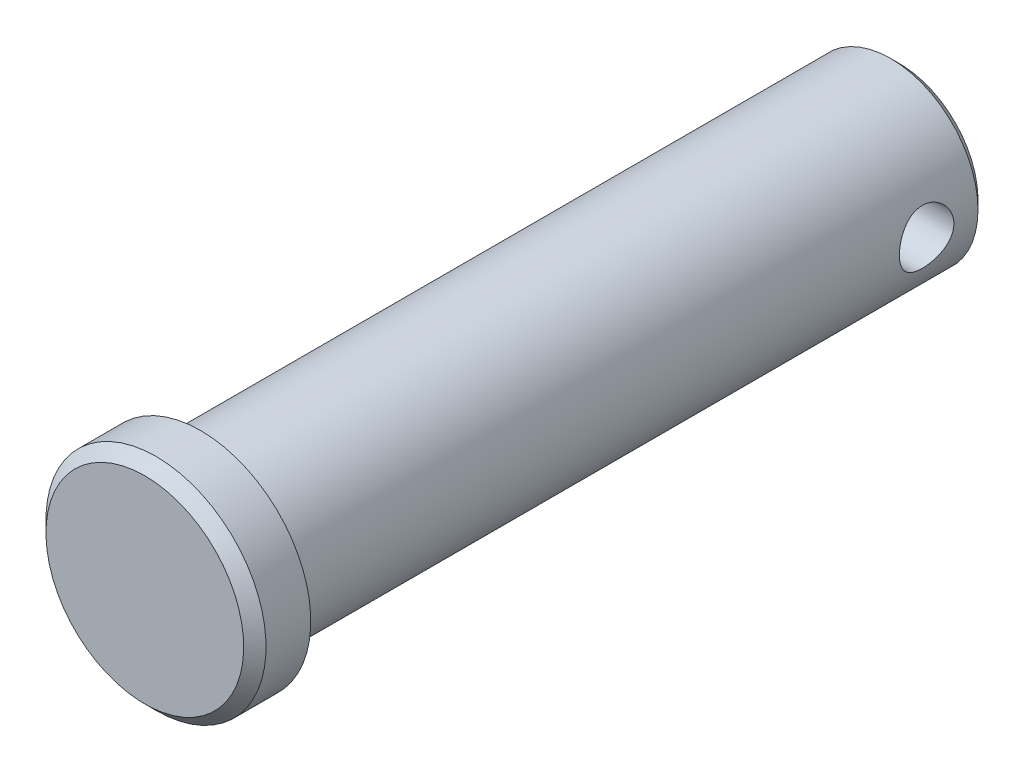
ISO-10303-21;
HEADER;
FILE_DESCRIPTION(('STEP AP214'),'2;1');
FILE_NAME('part.step','',(''),(''),'','','');
FILE_SCHEMA(('AUTOMOTIVE_DESIGN { 1 0 10303 214 1 1 1 1 }'));
ENDSEC;
DATA;
#1=APPLICATION_CONTEXT('core data for automotive mechanical design processes');
#2=APPLICATION_PROTOCOL_DEFINITION('international standard','automotive_design',2000,#1);
#3=PRODUCT_CONTEXT('',#1,'mechanical');
#4=PRODUCT('Part','Part','',(#3));
#5=PRODUCT_RELATED_PRODUCT_CATEGORY('part','',(#4));
#6=PRODUCT_DEFINITION_FORMATION('','',#4);
#7=PRODUCT_DEFINITION_CONTEXT('part definition',#1,'design');
#8=PRODUCT_DEFINITION('design','',#6,#7);
#9=PRODUCT_DEFINITION_SHAPE('','',#8);
#10=(LENGTH_UNIT() NAMED_UNIT(*) SI_UNIT(.MILLI.,.METRE.));
#11=(NAMED_UNIT(*) PLANE_ANGLE_UNIT() SI_UNIT($,.RADIAN.));
#12=(NAMED_UNIT(*) SI_UNIT($,.STERADIAN.) SOLID_ANGLE_UNIT());
#13=UNCERTAINTY_MEASURE_WITH_UNIT(LENGTH_MEASURE(1.E-05),#10,'distance_accuracy_value','');
#14=(GEOMETRIC_REPRESENTATION_CONTEXT(3) GLOBAL_UNCERTAINTY_ASSIGNED_CONTEXT((#13)) GLOBAL_UNIT_ASSIGNED_CONTEXT((#10,
#11,#12)) REPRESENTATION_CONTEXT('',''));
#15=CARTESIAN_POINT('',(0.,0.,0.));
#16=DIRECTION('',(0.,0.,1.));
#17=DIRECTION('',(1.,0.,0.));
#18=AXIS2_PLACEMENT_3D('',#15,#16,#17);
#19=CARTESIAN_POINT('',(0.,8.001,4.064));
#20=DIRECTION('',(0.,0.,-1.));
#21=DIRECTION('',(0.,1.,0.));
#22=AXIS2_PLACEMENT_3D('',#19,#20,#21);
#23=PLANE('',#22);
#24=CARTESIAN_POINT('',(0.,0.,4.064));
#25=DIRECTION('',(0.,0.,-1.));
#26=DIRECTION('',(0.,1.,0.));
#27=AXIS2_PLACEMENT_3D('',#24,#25,#26);
#28=CIRCLE('',#27,7.18820000000001);
#29=CARTESIAN_POINT('',(0.,7.18820000000001,4.064));
#30=VERTEX_POINT('',#29);
#31=EDGE_CURVE('E59',#30,#30,#28,.F.);
#32=ORIENTED_EDGE('',*,*,#31,.T.);
#33=EDGE_LOOP('',(#32));
#34=FACE_BOUND('',#33,.T.);
#35=ADVANCED_FACE('F39',(#34),#23,.F.);
#36=CARTESIAN_POINT('',(0.,0.,-50.8));
#37=DIRECTION('',(0.,0.,1.));
#38=DIRECTION('',(0.,-1.,0.));
#39=AXIS2_PLACEMENT_3D('',#36,#37,#38);
#40=PLANE('',#39);
#41=CARTESIAN_POINT('',(0.,0.,-50.8));
#42=DIRECTION('',(0.,0.,1.));
#43=DIRECTION('',(0.,-1.,0.));
#44=AXIS2_PLACEMENT_3D('',#41,#42,#43);
#45=CIRCLE('',#44,5.71499999999998);
#46=CARTESIAN_POINT('',(0.,-5.71499999999998,-50.8));
#47=VERTEX_POINT('',#46);
#48=EDGE_CURVE('E10',#47,#47,#45,.F.);
#49=ORIENTED_EDGE('',*,*,#48,.T.);
#50=EDGE_LOOP('',(#49));
#51=FACE_BOUND('',#50,.T.);
#52=ADVANCED_FACE('F101',(#51),#40,.F.);
#53=CARTESIAN_POINT('',(0.,0.,4.064));
#54=DIRECTION('',(0.,0.,1.));
#55=DIRECTION('',(0.,-1.,0.));
#56=AXIS2_PLACEMENT_3D('',#53,#54,#55);
#57=CYLINDRICAL_SURFACE('',#56,6.34999999999999);
#58=CARTESIAN_POINT('',(0.,0.,-50.165));
#59=DIRECTION('',(0.,0.,1.));
#60=DIRECTION('',(0.,-1.,0.));
#61=AXIS2_PLACEMENT_3D('',#58,#59,#60);
#62=CIRCLE('',#61,6.34999999999999);
#63=CARTESIAN_POINT('',(0.,-6.34999999999999,-50.165));
#64=VERTEX_POINT('',#63);
#65=EDGE_CURVE('E47',#64,#64,#62,.T.);
#66=ORIENTED_EDGE('',*,*,#65,.T.);
#67=EDGE_LOOP('',(#66));
#68=FACE_BOUND('',#67,.T.);
#69=CARTESIAN_POINT('',(6.34999999999999,0.,-44.45));
#70=CARTESIAN_POINT('',(6.34999944191376,0.108482053815228,-44.4500007337845));
#71=CARTESIAN_POINT('',(6.34719381979923,0.216971770239355,-44.4589393878878));
#72=CARTESIAN_POINT('',(6.33627648078363,0.430779061996672,-44.4943644733646));
#73=CARTESIAN_POINT('',(6.32816354743824,0.53609590431181,-44.5208549276568));
#74=CARTESIAN_POINT('',(6.30751797305865,0.740443365771951,-44.5904037433201));
#75=CARTESIAN_POINT('',(6.29499216266337,0.839483422702746,-44.6334365083785));
#76=CARTESIAN_POINT('',(6.26681449132437,1.02894200868958,-44.7347396623284));
#77=CARTESIAN_POINT('',(6.25116214092816,1.1193591845754,-44.79301243745));
#78=CARTESIAN_POINT('',(6.21785402476641,1.29179034799152,-44.9250306310239));
#79=CARTESIAN_POINT('',(6.20015471603801,1.37350150272824,-44.9991605575526));
#80=CARTESIAN_POINT('',(6.16500002189121,1.52355705933182,-45.1599700424155));
#81=CARTESIAN_POINT('',(6.14754468225747,1.59189898271284,-45.2466519225489));
#82=CARTESIAN_POINT('',(6.11438731602227,1.71491620179897,-45.4327239779473));
#83=CARTESIAN_POINT('',(6.09873904628134,1.76921353593219,-45.5323745214772));
#84=CARTESIAN_POINT('',(6.07162231429104,1.86015340123053,-45.7399596308529));
#85=CARTESIAN_POINT('',(6.06015275518069,1.89680056616585,-45.8478920137978));
#86=CARTESIAN_POINT('',(6.04314746427737,1.95029236843635,-46.0655604366484));
#87=CARTESIAN_POINT('',(6.03744388528544,1.96769861925333,-46.17514498297));
#88=CARTESIAN_POINT('',(6.03211795151023,1.9839690115304,-46.3958160020523));
#89=CARTESIAN_POINT('',(6.03249398595088,1.9828380643666,-46.5069020691962));
#90=CARTESIAN_POINT('',(6.03913661048651,1.96250549862908,-46.722780313119));
#91=CARTESIAN_POINT('',(6.04517060247605,1.94401739460316,-46.8276480541431));
#92=CARTESIAN_POINT('',(6.06207146491395,1.89065202360252,-47.0327119720165));
#93=CARTESIAN_POINT('',(6.07293884748615,1.85577301990125,-47.1329076525925));
#94=CARTESIAN_POINT('',(6.09846057701418,1.77011116752195,-47.3274848603652));
#95=CARTESIAN_POINT('',(6.1131678003889,1.71910397266693,-47.4217603868713));
#96=CARTESIAN_POINT('',(6.14468780418889,1.60278945947204,-47.6006483604944));
#97=CARTESIAN_POINT('',(6.16150112961325,1.53747843642393,-47.6852582955575));
#98=CARTESIAN_POINT('',(6.19627243074903,1.3909072470218,-47.8464476308817));
#99=CARTESIAN_POINT('',(6.21424773084579,1.3090579269484,-47.9224885533689));
#100=CARTESIAN_POINT('',(6.24864473433523,1.13354547932791,-48.0598957991072));
#101=CARTESIAN_POINT('',(6.26506632330994,1.0398814829109,-48.1212610421236));
#102=CARTESIAN_POINT('',(6.29467713227722,0.842363110753371,-48.2279383099901));
#103=CARTESIAN_POINT('',(6.30784032074609,0.738435399445828,-48.2731222642395));
#104=CARTESIAN_POINT('',(6.32926329113115,0.523948186331732,-48.3452065753361));
#105=CARTESIAN_POINT('',(6.33752455689238,0.413390702571117,-48.3721124654341));
#106=CARTESIAN_POINT('',(6.34797425872441,0.193353285953614,-48.4059604558115));
#107=CARTESIAN_POINT('',(6.35038433771717,0.0839958564551726,-48.4136315579746));
#108=CARTESIAN_POINT('',(6.34951541983827,-0.134455241936333,-48.4108471403225));
#109=CARTESIAN_POINT('',(6.3462372510912,-0.243548946908365,-48.400394259091));
#110=CARTESIAN_POINT('',(6.33450579291727,-0.455566407218527,-48.3622440016518));
#111=CARTESIAN_POINT('',(6.32618267316008,-0.558576053230563,-48.3349800871439));
#112=CARTESIAN_POINT('',(6.30533468544982,-0.758530329266332,-48.2645102968626));
#113=CARTESIAN_POINT('',(6.29280929908845,-0.8554742092415,-48.2213024541173));
#114=CARTESIAN_POINT('',(6.26446594711381,-1.04316845855611,-48.1189958270852));
#115=CARTESIAN_POINT('',(6.2485752848036,-1.13371074325382,-48.0595359794976));
#116=CARTESIAN_POINT('',(6.21531870814297,-1.30377700855769,-47.9268466105727));
#117=CARTESIAN_POINT('',(6.197952395596,-1.38329799979672,-47.8536133660458));
#118=CARTESIAN_POINT('',(6.16283879297724,-1.53232382846575,-47.6920273929664));
#119=CARTESIAN_POINT('',(6.14510353983199,-1.6013091238034,-47.6031918035404));
#120=CARTESIAN_POINT('',(6.11197799587686,-1.72343932207346,-47.4148198339579));
#121=CARTESIAN_POINT('',(6.09658766672326,-1.77658448403406,-47.3152836288212));
#122=CARTESIAN_POINT('',(6.07006550850933,-1.86519398798624,-47.1085463428621));
#123=CARTESIAN_POINT('',(6.05891707896058,-1.90072742155151,-47.0013771312344));
#124=CARTESIAN_POINT('',(6.04223475204794,-1.95311797642365,-46.782157721198));
#125=CARTESIAN_POINT('',(6.03669872710473,-1.9699821751836,-46.6701093892039));
#126=CARTESIAN_POINT('',(6.03208922070768,-1.98404841957654,-46.4497422276227));
#127=CARTESIAN_POINT('',(6.03273566320141,-1.98210254813816,-46.3414829719943));
#128=CARTESIAN_POINT('',(6.03973816078873,-1.96065990594655,-46.1269145016671));
#129=CARTESIAN_POINT('',(6.04609395112868,-1.9411639490251,-46.0206051967786));
#130=CARTESIAN_POINT('',(6.06360361669001,-1.88574411949658,-45.8144727165351));
#131=CARTESIAN_POINT('',(6.07468635401468,-1.85006333296051,-45.7145776874058));
#132=CARTESIAN_POINT('',(6.10038320870058,-1.76347802520767,-45.5221124322448));
#133=CARTESIAN_POINT('',(6.11499804262719,-1.71257041438791,-45.4295436975818));
#134=CARTESIAN_POINT('',(6.14682376027785,-1.59465360497169,-45.2504494059171));
#135=CARTESIAN_POINT('',(6.16411368075141,-1.52709370854491,-45.1643005118371));
#136=CARTESIAN_POINT('',(6.19897711400449,-1.37876003793044,-45.0042866204367));
#137=CARTESIAN_POINT('',(6.21655070140983,-1.29798273376409,-44.9304249153175));
#138=CARTESIAN_POINT('',(6.25068675771308,-1.12234730875009,-44.7946787001703));
#139=CARTESIAN_POINT('',(6.26719777927838,-1.02711678448609,-44.7332616514573));
#140=CARTESIAN_POINT('',(6.29670403212196,-0.827167793857511,-44.627389860849));
#141=CARTESIAN_POINT('',(6.30970065578047,-0.722453107068465,-44.5829283983943));
#142=CARTESIAN_POINT('',(6.32979841262773,-0.51575053626378,-44.5154898029128));
#143=CARTESIAN_POINT('',(6.33730835767022,-0.414293993433629,-44.4910017062912));
#144=CARTESIAN_POINT('',(6.3474089256386,-0.208560280249511,-44.458258082101));
#145=CARTESIAN_POINT('',(6.35000053648768,-0.104283680616353,-44.4499992946138));
#146=CARTESIAN_POINT('',(6.34999999999999,0.,-44.45));
#147=B_SPLINE_CURVE_WITH_KNOTS('',3,(#69,#70,#71,#72,#73,#74,#75,#76,#77,#78,#79,#80,#81,#82,
#83,#84,#85,#86,#87,#88,#89,#90,#91,#92,#93,#94,#95,#96,#97,#98,#99,#100,#101,#102,#103,#104,
#105,#106,#107,#108,#109,#110,#111,#112,#113,#114,#115,#116,#117,#118,#119,#120,#121,#122,#123,
#124,#125,#126,#127,#128,#129,#130,#131,#132,#133,#134,#135,#136,#137,#138,#139,#140,#141,#142,
#143,#144,#145,#146),.UNSPECIFIED.,.T.,.F.,(4,2,2,2,2,2,2,2,2,2,2,2,2,2,2,2,2,2,2,2,2,2,2,2,2,2,
2,2,2,2,2,2,2,2,2,2,2,2,4),(0.,0.325062858956952,0.650200248963251,0.974836558086937,
1.2995237281484,1.63322138908659,1.96698085483201,2.30895873520362,2.65084678573534,
2.98246809302846,3.31400153965192,3.63247668609597,3.95098558474395,4.274135830721,
4.5973698721777,4.93526838767173,5.27319176725856,5.61373350474316,5.95417210529009,
6.28149854460843,6.60877733404482,6.9279512305507,7.24716451610296,7.57414457407804,
7.90121314784142,8.24119754649975,8.58117638520643,8.91981070158702,9.25831659866648,
9.58156293728559,9.90479428711222,10.2233239035372,10.5419181951968,10.8729420342465,
11.2040544247023,11.5459316392744,11.8876732053316,12.2002185651122,12.5127011386947),.UNSPECIFIED.);
#148=CARTESIAN_POINT('',(6.34999999999999,0.,-44.45));
#149=VERTEX_POINT('',#148);
#150=EDGE_CURVE('E66',#149,#149,#147,.T.);
#151=ORIENTED_EDGE('',*,*,#150,.T.);
#152=EDGE_LOOP('',(#151));
#153=FACE_BOUND('',#152,.T.);
#154=CARTESIAN_POINT('',(-6.34999999999999,0.,-44.45));
#155=CARTESIAN_POINT('',(-6.34999944191376,-0.108482053815228,-44.4500007337845));
#156=CARTESIAN_POINT('',(-6.34719381979923,-0.216971770239355,-44.4589393878878));
#157=CARTESIAN_POINT('',(-6.33627648078363,-0.430779061996672,-44.4943644733646));
#158=CARTESIAN_POINT('',(-6.32816354743824,-0.53609590431181,-44.5208549276568));
#159=CARTESIAN_POINT('',(-6.30751797305865,-0.740443365771951,-44.5904037433201));
#160=CARTESIAN_POINT('',(-6.29499216266337,-0.839483422702746,-44.6334365083785));
#161=CARTESIAN_POINT('',(-6.26681449132437,-1.02894200868958,-44.7347396623284));
#162=CARTESIAN_POINT('',(-6.25116214092816,-1.1193591845754,-44.79301243745));
#163=CARTESIAN_POINT('',(-6.21785402476641,-1.29179034799152,-44.9250306310239));
#164=CARTESIAN_POINT('',(-6.20015471603801,-1.37350150272824,-44.9991605575526));
#165=CARTESIAN_POINT('',(-6.16500002189121,-1.52355705933182,-45.1599700424155));
#166=CARTESIAN_POINT('',(-6.14754468225747,-1.59189898271284,-45.2466519225489));
#167=CARTESIAN_POINT('',(-6.11438731602227,-1.71491620179897,-45.4327239779473));
#168=CARTESIAN_POINT('',(-6.09873904628134,-1.76921353593219,-45.5323745214772));
#169=CARTESIAN_POINT('',(-6.07162231429104,-1.86015340123053,-45.7399596308529));
#170=CARTESIAN_POINT('',(-6.06015275518069,-1.89680056616585,-45.8478920137978));
#171=CARTESIAN_POINT('',(-6.04314746427737,-1.95029236843635,-46.0655604366484));
#172=CARTESIAN_POINT('',(-6.03744388528544,-1.96769861925333,-46.17514498297));
#173=CARTESIAN_POINT('',(-6.03211795151023,-1.9839690115304,-46.3958160020523));
#174=CARTESIAN_POINT('',(-6.03249398595088,-1.9828380643666,-46.5069020691962));
#175=CARTESIAN_POINT('',(-6.03913661048651,-1.96250549862908,-46.722780313119));
#176=CARTESIAN_POINT('',(-6.04517060247605,-1.94401739460316,-46.8276480541431));
#177=CARTESIAN_POINT('',(-6.06207146491395,-1.89065202360252,-47.0327119720165));
#178=CARTESIAN_POINT('',(-6.07293884748615,-1.85577301990125,-47.1329076525925));
#179=CARTESIAN_POINT('',(-6.09846057701418,-1.77011116752195,-47.3274848603652));
#180=CARTESIAN_POINT('',(-6.1131678003889,-1.71910397266693,-47.4217603868713));
#181=CARTESIAN_POINT('',(-6.14468780418889,-1.60278945947204,-47.6006483604944));
#182=CARTESIAN_POINT('',(-6.16150112961325,-1.53747843642393,-47.6852582955575));
#183=CARTESIAN_POINT('',(-6.19627243074903,-1.3909072470218,-47.8464476308817));
#184=CARTESIAN_POINT('',(-6.21424773084579,-1.3090579269484,-47.9224885533689));
#185=CARTESIAN_POINT('',(-6.24864473433523,-1.13354547932791,-48.0598957991072));
#186=CARTESIAN_POINT('',(-6.26506632330994,-1.0398814829109,-48.1212610421236));
#187=CARTESIAN_POINT('',(-6.29467713227722,-0.842363110753371,-48.2279383099901));
#188=CARTESIAN_POINT('',(-6.30784032074609,-0.738435399445828,-48.2731222642395));
#189=CARTESIAN_POINT('',(-6.32926329113115,-0.523948186331732,-48.3452065753361));
#190=CARTESIAN_POINT('',(-6.33752455689238,-0.413390702571117,-48.3721124654341));
#191=CARTESIAN_POINT('',(-6.34797425872441,-0.193353285953614,-48.4059604558115));
#192=CARTESIAN_POINT('',(-6.35038433771717,-0.0839958564551726,-48.4136315579746));
#193=CARTESIAN_POINT('',(-6.34951541983827,0.134455241936333,-48.4108471403225));
#194=CARTESIAN_POINT('',(-6.34623725109121,0.243548946908365,-48.400394259091));
#195=CARTESIAN_POINT('',(-6.33450579291727,0.455566407218527,-48.3622440016518));
#196=CARTESIAN_POINT('',(-6.32618267316008,0.558576053230562,-48.3349800871439));
#197=CARTESIAN_POINT('',(-6.30533468544982,0.758530329266332,-48.2645102968626));
#198=CARTESIAN_POINT('',(-6.29280929908845,0.8554742092415,-48.2213024541173));
#199=CARTESIAN_POINT('',(-6.26446594711381,1.04316845855611,-48.1189958270852));
#200=CARTESIAN_POINT('',(-6.2485752848036,1.13371074325382,-48.0595359794976));
#201=CARTESIAN_POINT('',(-6.21531870814297,1.30377700855769,-47.9268466105727));
#202=CARTESIAN_POINT('',(-6.197952395596,1.38329799979672,-47.8536133660458));
#203=CARTESIAN_POINT('',(-6.16283879297724,1.53232382846575,-47.6920273929664));
#204=CARTESIAN_POINT('',(-6.14510353983199,1.6013091238034,-47.6031918035404));
#205=CARTESIAN_POINT('',(-6.11197799587686,1.72343932207346,-47.4148198339579));
#206=CARTESIAN_POINT('',(-6.09658766672326,1.77658448403406,-47.3152836288212));
#207=CARTESIAN_POINT('',(-6.07006550850933,1.86519398798625,-47.1085463428621));
#208=CARTESIAN_POINT('',(-6.05891707896058,1.90072742155151,-47.0013771312344));
#209=CARTESIAN_POINT('',(-6.04223475204794,1.95311797642365,-46.782157721198));
#210=CARTESIAN_POINT('',(-6.03669872710473,1.9699821751836,-46.6701093892039));
#211=CARTESIAN_POINT('',(-6.03208922070768,1.98404841957654,-46.4497422276227));
#212=CARTESIAN_POINT('',(-6.03273566320141,1.98210254813816,-46.3414829719943));
#213=CARTESIAN_POINT('',(-6.03973816078873,1.96065990594655,-46.1269145016671));
#214=CARTESIAN_POINT('',(-6.04609395112868,1.9411639490251,-46.0206051967786));
#215=CARTESIAN_POINT('',(-6.06360361669001,1.88574411949658,-45.8144727165351));
#216=CARTESIAN_POINT('',(-6.07468635401468,1.85006333296051,-45.7145776874058));
#217=CARTESIAN_POINT('',(-6.10038320870058,1.76347802520767,-45.5221124322448));
#218=CARTESIAN_POINT('',(-6.11499804262719,1.71257041438791,-45.4295436975818));
#219=CARTESIAN_POINT('',(-6.14682376027785,1.59465360497169,-45.2504494059171));
#220=CARTESIAN_POINT('',(-6.16411368075141,1.52709370854491,-45.1643005118371));
#221=CARTESIAN_POINT('',(-6.19897711400448,1.37876003793044,-45.0042866204367));
#222=CARTESIAN_POINT('',(-6.21655070140983,1.29798273376409,-44.9304249153175));
#223=CARTESIAN_POINT('',(-6.25068675771308,1.1223473087501,-44.7946787001703));
#224=CARTESIAN_POINT('',(-6.26719777927838,1.02711678448609,-44.7332616514573));
#225=CARTESIAN_POINT('',(-6.29670403212196,0.827167793857512,-44.627389860849));
#226=CARTESIAN_POINT('',(-6.30970065578047,0.722453107068465,-44.5829283983943));
#227=CARTESIAN_POINT('',(-6.32979841262773,0.51575053626378,-44.5154898029128));
#228=CARTESIAN_POINT('',(-6.33730835767022,0.414293993433628,-44.4910017062912));
#229=CARTESIAN_POINT('',(-6.3474089256386,0.208560280249511,-44.458258082101));
#230=CARTESIAN_POINT('',(-6.35000053648768,0.104283680616353,-44.4499992946138));
#231=CARTESIAN_POINT('',(-6.34999999999999,0.,-44.45));
#232=B_SPLINE_CURVE_WITH_KNOTS('',3,(#154,#155,#156,#157,#158,#159,#160,#161,#162,#163,#164,
#165,#166,#167,#168,#169,#170,#171,#172,#173,#174,#175,#176,#177,#178,#179,#180,#181,#182,#183,
#184,#185,#186,#187,#188,#189,#190,#191,#192,#193,#194,#195,#196,#197,#198,#199,#200,#201,#202,
#203,#204,#205,#206,#207,#208,#209,#210,#211,#212,#213,#214,#215,#216,#217,#218,#219,#220,#221,
#222,#223,#224,#225,#226,#227,#228,#229,#230,#231),.UNSPECIFIED.,.T.,.F.,(4,2,2,2,2,2,2,2,2,2,2,
2,2,2,2,2,2,2,2,2,2,2,2,2,2,2,2,2,2,2,2,2,2,2,2,2,2,2,4),(0.,0.325062858956952,
0.650200248963251,0.974836558086937,1.2995237281484,1.63322138908659,1.96698085483201,
2.30895873520362,2.65084678573534,2.98246809302846,3.31400153965192,3.63247668609597,
3.95098558474395,4.274135830721,4.5973698721777,4.93526838767173,5.27319176725856,
5.61373350474316,5.95417210529009,6.28149854460843,6.60877733404482,6.9279512305507,
7.24716451610296,7.57414457407804,7.90121314784142,8.24119754649974,8.58117638520644,
8.91981070158703,9.25831659866649,9.5815629372856,9.90479428711222,10.2233239035372,
10.5419181951968,10.8729420342465,11.2040544247023,11.5459316392744,11.8876732053316,
12.2002185651122,12.5127011386947),.UNSPECIFIED.);
#233=CARTESIAN_POINT('',(-6.34999999999999,0.,-44.45));
#234=VERTEX_POINT('',#233);
#235=EDGE_CURVE('E76',#234,#234,#232,.T.);
#236=ORIENTED_EDGE('',*,*,#235,.T.);
#237=EDGE_LOOP('',(#236));
#238=FACE_BOUND('',#237,.T.);
#239=CARTESIAN_POINT('',(0.,0.,0.));
#240=DIRECTION('',(0.,0.,1.));
#241=DIRECTION('',(0.,-1.,0.));
#242=AXIS2_PLACEMENT_3D('',#239,#240,#241);
#243=CIRCLE('',#242,6.34999999999999);
#244=CARTESIAN_POINT('',(0.,-6.34999999999999,0.));
#245=VERTEX_POINT('',#244);
#246=EDGE_CURVE('E65',#245,#245,#243,.T.);
#247=ORIENTED_EDGE('',*,*,#246,.F.);
#248=EDGE_LOOP('',(#247));
#249=FACE_BOUND('',#248,.T.);
#250=ADVANCED_FACE('F81',(#68,#153,#238,#249),#57,.T.);
#251=CARTESIAN_POINT('',(0.,6.34999999999999,0.));
#252=DIRECTION('',(0.,0.,1.));
#253=DIRECTION('',(0.,-1.,0.));
#254=AXIS2_PLACEMENT_3D('',#251,#252,#253);
#255=PLANE('',#254);
#256=CARTESIAN_POINT('',(0.,0.,0.));
#257=DIRECTION('',(0.,0.,1.));
#258=DIRECTION('',(0.,-1.,0.));
#259=AXIS2_PLACEMENT_3D('',#256,#257,#258);
#260=CIRCLE('',#259,8.001);
#261=CARTESIAN_POINT('',(0.,-8.001,0.));
#262=VERTEX_POINT('',#261);
#263=EDGE_CURVE('E75',#262,#262,#260,.T.);
#264=ORIENTED_EDGE('',*,*,#263,.F.);
#265=EDGE_LOOP('',(#264));
#266=FACE_BOUND('',#265,.T.);
#267=ORIENTED_EDGE('',*,*,#246,.T.);
#268=EDGE_LOOP('',(#267));
#269=FACE_BOUND('',#268,.T.);
#270=ADVANCED_FACE('F94',(#266,#269),#255,.F.);
#271=CARTESIAN_POINT('',(0.,0.,4.064));
#272=DIRECTION('',(0.,0.,1.));
#273=DIRECTION('',(0.,-1.,0.));
#274=AXIS2_PLACEMENT_3D('',#271,#272,#273);
#275=CYLINDRICAL_SURFACE('',#274,8.001);
#276=CARTESIAN_POINT('',(0.,0.,3.25120000000001));
#277=DIRECTION('',(0.,0.,-1.));
#278=DIRECTION('',(0.,1.,0.));
#279=AXIS2_PLACEMENT_3D('',#276,#277,#278);
#280=CIRCLE('',#279,8.001);
#281=CARTESIAN_POINT('',(0.,8.001,3.25120000000001));
#282=VERTEX_POINT('',#281);
#283=EDGE_CURVE('E53',#282,#282,#280,.T.);
#284=ORIENTED_EDGE('',*,*,#283,.T.);
#285=EDGE_LOOP('',(#284));
#286=FACE_BOUND('',#285,.T.);
#287=ORIENTED_EDGE('',*,*,#263,.T.);
#288=EDGE_LOOP('',(#287));
#289=FACE_BOUND('',#288,.T.);
#290=ADVANCED_FACE('F90',(#286,#289),#275,.T.);
#291=CARTESIAN_POINT('',(8.001,0.,-46.4312));
#292=DIRECTION('',(-1.,0.,0.));
#293=DIRECTION('',(0.,0.,1.));
#294=AXIS2_PLACEMENT_3D('',#291,#292,#293);
#295=CYLINDRICAL_SURFACE('',#294,1.98119999999999);
#296=ORIENTED_EDGE('',*,*,#235,.F.);
#297=EDGE_LOOP('',(#296));
#298=FACE_BOUND('',#297,.T.);
#299=ORIENTED_EDGE('',*,*,#150,.F.);
#300=EDGE_LOOP('',(#299));
#301=FACE_BOUND('',#300,.T.);
#302=ADVANCED_FACE('F85',(#298,#301),#295,.F.);
#303=CARTESIAN_POINT('',(0.,0.,4.064));
#304=DIRECTION('',(0.,0.,-1.));
#305=DIRECTION('',(0.,1.,0.));
#306=AXIS2_PLACEMENT_3D('',#303,#304,#305);
#307=CONICAL_SURFACE('',#306,7.18820000000001,0.785398163397445);
#308=ORIENTED_EDGE('',*,*,#283,.F.);
#309=EDGE_LOOP('',(#308));
#310=FACE_BOUND('',#309,.T.);
#311=ORIENTED_EDGE('',*,*,#31,.F.);
#312=EDGE_LOOP('',(#311));
#313=FACE_BOUND('',#312,.T.);
#314=ADVANCED_FACE('F89',(#310,#313),#307,.T.);
#315=CARTESIAN_POINT('',(0.,0.,-50.165));
#316=DIRECTION('',(0.,0.,1.));
#317=DIRECTION('',(0.,-1.,0.));
#318=AXIS2_PLACEMENT_3D('',#315,#316,#317);
#319=CONICAL_SURFACE('',#318,6.34999999999999,0.78539816339745);
#320=ORIENTED_EDGE('',*,*,#48,.F.);
#321=EDGE_LOOP('',(#320));
#322=FACE_BOUND('',#321,.T.);
#323=ORIENTED_EDGE('',*,*,#65,.F.);
#324=EDGE_LOOP('',(#323));
#325=FACE_BOUND('',#324,.T.);
#326=ADVANCED_FACE('F41',(#322,#325),#319,.T.);
#327=CLOSED_SHELL('',(#35,#52,#250,#270,#290,#302,#314,#326));
#328=MANIFOLD_SOLID_BREP('B2',#327);
#329=ADVANCED_BREP_SHAPE_REPRESENTATION('',(#18,#328),#14);
#330=SHAPE_DEFINITION_REPRESENTATION(#9,#329);
ENDSEC;
END-ISO-10303-21;
